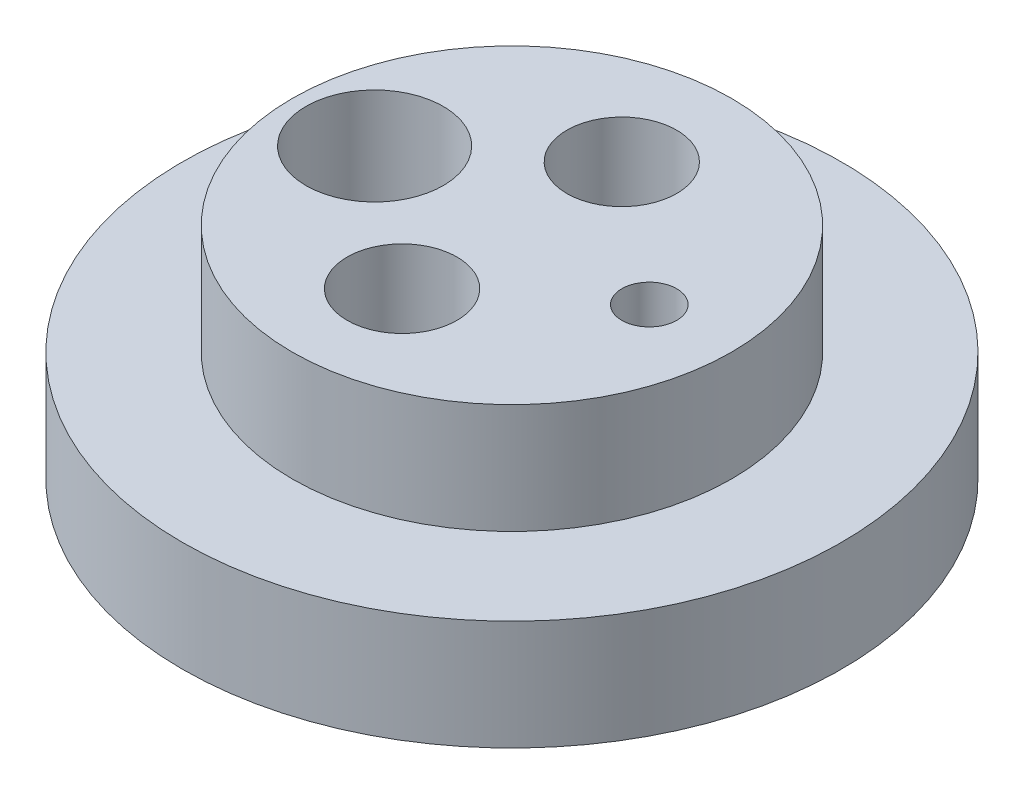
ISO-10303-21;
HEADER;
FILE_DESCRIPTION(('STEP AP214'),'2;1');
FILE_NAME('part.step','',(''),(''),'','','');
FILE_SCHEMA(('AUTOMOTIVE_DESIGN { 1 0 10303 214 1 1 1 1 }'));
ENDSEC;
DATA;
#1=APPLICATION_CONTEXT('core data for automotive mechanical design processes');
#2=APPLICATION_PROTOCOL_DEFINITION('international standard','automotive_design',2000,#1);
#3=PRODUCT_CONTEXT('',#1,'mechanical');
#4=PRODUCT('Part','Part','',(#3));
#5=PRODUCT_RELATED_PRODUCT_CATEGORY('part','',(#4));
#6=PRODUCT_DEFINITION_FORMATION('','',#4);
#7=PRODUCT_DEFINITION_CONTEXT('part definition',#1,'design');
#8=PRODUCT_DEFINITION('design','',#6,#7);
#9=PRODUCT_DEFINITION_SHAPE('','',#8);
#10=(LENGTH_UNIT() NAMED_UNIT(*) SI_UNIT(.MILLI.,.METRE.));
#11=(NAMED_UNIT(*) PLANE_ANGLE_UNIT() SI_UNIT($,.RADIAN.));
#12=(NAMED_UNIT(*) SI_UNIT($,.STERADIAN.) SOLID_ANGLE_UNIT());
#13=UNCERTAINTY_MEASURE_WITH_UNIT(LENGTH_MEASURE(1.E-05),#10,'distance_accuracy_value','');
#14=(GEOMETRIC_REPRESENTATION_CONTEXT(3) GLOBAL_UNCERTAINTY_ASSIGNED_CONTEXT((#13)) GLOBAL_UNIT_ASSIGNED_CONTEXT((#10,
#11,#12)) REPRESENTATION_CONTEXT('',''));
#15=CARTESIAN_POINT('',(0.,0.,0.));
#16=DIRECTION('',(0.,0.,1.));
#17=DIRECTION('',(1.,0.,0.));
#18=AXIS2_PLACEMENT_3D('',#15,#16,#17);
#19=CARTESIAN_POINT('',(0.,8.,0.));
#20=DIRECTION('',(0.,-1.,0.));
#21=DIRECTION('',(0.,0.,-1.));
#22=AXIS2_PLACEMENT_3D('',#19,#20,#21);
#23=CYLINDRICAL_SURFACE('',#22,24.);
#24=CARTESIAN_POINT('',(0.,8.,0.));
#25=DIRECTION('',(0.,1.,0.));
#26=DIRECTION('',(0.,0.,1.));
#27=AXIS2_PLACEMENT_3D('',#24,#25,#26);
#28=CIRCLE('',#27,24.);
#29=CARTESIAN_POINT('',(0.,8.,24.));
#30=VERTEX_POINT('',#29);
#31=EDGE_CURVE('E51',#30,#30,#28,.T.);
#32=ORIENTED_EDGE('',*,*,#31,.F.);
#33=EDGE_LOOP('',(#32));
#34=FACE_BOUND('',#33,.T.);
#35=CARTESIAN_POINT('',(0.,0.,0.));
#36=DIRECTION('',(0.,1.,0.));
#37=DIRECTION('',(0.,0.,1.));
#38=AXIS2_PLACEMENT_3D('',#35,#36,#37);
#39=CIRCLE('',#38,24.);
#40=CARTESIAN_POINT('',(0.,0.,24.));
#41=VERTEX_POINT('',#40);
#42=EDGE_CURVE('E46',#41,#41,#39,.T.);
#43=ORIENTED_EDGE('',*,*,#42,.T.);
#44=EDGE_LOOP('',(#43));
#45=FACE_BOUND('',#44,.T.);
#46=ADVANCED_FACE('F43',(#34,#45),#23,.T.);
#47=CARTESIAN_POINT('',(0.,8.,0.));
#48=DIRECTION('',(0.,1.,0.));
#49=DIRECTION('',(0.,0.,1.));
#50=AXIS2_PLACEMENT_3D('',#47,#48,#49);
#51=PLANE('',#50);
#52=CARTESIAN_POINT('',(0.,8.,0.));
#53=DIRECTION('',(0.,1.,0.));
#54=DIRECTION('',(0.,0.,1.));
#55=AXIS2_PLACEMENT_3D('',#52,#53,#54);
#56=CIRCLE('',#55,16.);
#57=CARTESIAN_POINT('',(0.,8.,16.));
#58=VERTEX_POINT('',#57);
#59=EDGE_CURVE('E10',#58,#58,#56,.T.);
#60=ORIENTED_EDGE('',*,*,#59,.F.);
#61=EDGE_LOOP('',(#60));
#62=FACE_BOUND('',#61,.T.);
#63=ORIENTED_EDGE('',*,*,#31,.T.);
#64=EDGE_LOOP('',(#63));
#65=FACE_BOUND('',#64,.T.);
#66=ADVANCED_FACE('F125',(#62,#65),#51,.T.);
#67=CARTESIAN_POINT('',(0.,0.,0.));
#68=DIRECTION('',(0.,1.,0.));
#69=DIRECTION('',(0.,0.,1.));
#70=AXIS2_PLACEMENT_3D('',#67,#68,#69);
#71=PLANE('',#70);
#72=CARTESIAN_POINT('',(-10.,0.,0.));
#73=DIRECTION('',(0.,1.,0.));
#74=DIRECTION('',(0.,0.,1.));
#75=AXIS2_PLACEMENT_3D('',#72,#73,#74);
#76=CIRCLE('',#75,5.);
#77=CARTESIAN_POINT('',(-10.,0.,5.));
#78=VERTEX_POINT('',#77);
#79=EDGE_CURVE('E62',#78,#78,#76,.T.);
#80=ORIENTED_EDGE('',*,*,#79,.T.);
#81=EDGE_LOOP('',(#80));
#82=FACE_BOUND('',#81,.T.);
#83=CARTESIAN_POINT('',(0.,0.,-8.));
#84=DIRECTION('',(0.,1.,0.));
#85=DIRECTION('',(0.,0.,1.));
#86=AXIS2_PLACEMENT_3D('',#83,#84,#85);
#87=CIRCLE('',#86,4.);
#88=CARTESIAN_POINT('',(0.,0.,-4.));
#89=VERTEX_POINT('',#88);
#90=EDGE_CURVE('E79',#89,#89,#87,.T.);
#91=ORIENTED_EDGE('',*,*,#90,.T.);
#92=EDGE_LOOP('',(#91));
#93=FACE_BOUND('',#92,.T.);
#94=CARTESIAN_POINT('',(0.,0.,8.));
#95=DIRECTION('',(0.,1.,0.));
#96=DIRECTION('',(0.,0.,1.));
#97=AXIS2_PLACEMENT_3D('',#94,#95,#96);
#98=CIRCLE('',#97,4.);
#99=CARTESIAN_POINT('',(0.,0.,12.));
#100=VERTEX_POINT('',#99);
#101=EDGE_CURVE('E71',#100,#100,#98,.T.);
#102=ORIENTED_EDGE('',*,*,#101,.T.);
#103=EDGE_LOOP('',(#102));
#104=FACE_BOUND('',#103,.T.);
#105=CARTESIAN_POINT('',(10.,0.,0.));
#106=DIRECTION('',(0.,1.,0.));
#107=DIRECTION('',(0.,0.,1.));
#108=AXIS2_PLACEMENT_3D('',#105,#106,#107);
#109=CIRCLE('',#108,2.);
#110=CARTESIAN_POINT('',(10.,0.,2.));
#111=VERTEX_POINT('',#110);
#112=EDGE_CURVE('E63',#111,#111,#109,.T.);
#113=ORIENTED_EDGE('',*,*,#112,.T.);
#114=EDGE_LOOP('',(#113));
#115=FACE_BOUND('',#114,.T.);
#116=ORIENTED_EDGE('',*,*,#42,.F.);
#117=EDGE_LOOP('',(#116));
#118=FACE_BOUND('',#117,.T.);
#119=ADVANCED_FACE('F95',(#82,#93,#104,#115,#118),#71,.F.);
#120=CARTESIAN_POINT('',(0.,16.,0.));
#121=DIRECTION('',(0.,-1.,0.));
#122=DIRECTION('',(0.,0.,-1.));
#123=AXIS2_PLACEMENT_3D('',#120,#121,#122);
#124=CYLINDRICAL_SURFACE('',#123,16.);
#125=CARTESIAN_POINT('',(0.,16.,0.));
#126=DIRECTION('',(0.,1.,0.));
#127=DIRECTION('',(0.,0.,1.));
#128=AXIS2_PLACEMENT_3D('',#125,#126,#127);
#129=CIRCLE('',#128,16.);
#130=CARTESIAN_POINT('',(0.,16.,16.));
#131=VERTEX_POINT('',#130);
#132=EDGE_CURVE('E58',#131,#131,#129,.T.);
#133=ORIENTED_EDGE('',*,*,#132,.F.);
#134=EDGE_LOOP('',(#133));
#135=FACE_BOUND('',#134,.T.);
#136=ORIENTED_EDGE('',*,*,#59,.T.);
#137=EDGE_LOOP('',(#136));
#138=FACE_BOUND('',#137,.T.);
#139=ADVANCED_FACE('F109',(#135,#138),#124,.T.);
#140=CARTESIAN_POINT('',(0.,16.,0.));
#141=DIRECTION('',(0.,1.,0.));
#142=DIRECTION('',(0.,0.,1.));
#143=AXIS2_PLACEMENT_3D('',#140,#141,#142);
#144=PLANE('',#143);
#145=CARTESIAN_POINT('',(-10.,16.,0.));
#146=DIRECTION('',(0.,1.,0.));
#147=DIRECTION('',(0.,0.,1.));
#148=AXIS2_PLACEMENT_3D('',#145,#146,#147);
#149=CIRCLE('',#148,5.);
#150=CARTESIAN_POINT('',(-10.,16.,5.));
#151=VERTEX_POINT('',#150);
#152=EDGE_CURVE('E87',#151,#151,#149,.T.);
#153=ORIENTED_EDGE('',*,*,#152,.F.);
#154=EDGE_LOOP('',(#153));
#155=FACE_BOUND('',#154,.T.);
#156=CARTESIAN_POINT('',(0.,16.,-8.));
#157=DIRECTION('',(0.,1.,0.));
#158=DIRECTION('',(0.,0.,1.));
#159=AXIS2_PLACEMENT_3D('',#156,#157,#158);
#160=CIRCLE('',#159,4.);
#161=CARTESIAN_POINT('',(0.,16.,-4.));
#162=VERTEX_POINT('',#161);
#163=EDGE_CURVE('E83',#162,#162,#160,.T.);
#164=ORIENTED_EDGE('',*,*,#163,.F.);
#165=EDGE_LOOP('',(#164));
#166=FACE_BOUND('',#165,.T.);
#167=CARTESIAN_POINT('',(0.,16.,8.));
#168=DIRECTION('',(0.,1.,0.));
#169=DIRECTION('',(0.,0.,1.));
#170=AXIS2_PLACEMENT_3D('',#167,#168,#169);
#171=CIRCLE('',#170,4.);
#172=CARTESIAN_POINT('',(0.,16.,12.));
#173=VERTEX_POINT('',#172);
#174=EDGE_CURVE('E75',#173,#173,#171,.T.);
#175=ORIENTED_EDGE('',*,*,#174,.F.);
#176=EDGE_LOOP('',(#175));
#177=FACE_BOUND('',#176,.T.);
#178=CARTESIAN_POINT('',(10.,16.,0.));
#179=DIRECTION('',(0.,1.,0.));
#180=DIRECTION('',(0.,0.,1.));
#181=AXIS2_PLACEMENT_3D('',#178,#179,#180);
#182=CIRCLE('',#181,2.);
#183=CARTESIAN_POINT('',(10.,16.,2.));
#184=VERTEX_POINT('',#183);
#185=EDGE_CURVE('E67',#184,#184,#182,.T.);
#186=ORIENTED_EDGE('',*,*,#185,.F.);
#187=EDGE_LOOP('',(#186));
#188=FACE_BOUND('',#187,.T.);
#189=ORIENTED_EDGE('',*,*,#132,.T.);
#190=EDGE_LOOP('',(#189));
#191=FACE_BOUND('',#190,.T.);
#192=ADVANCED_FACE('F105',(#155,#166,#177,#188,#191),#144,.T.);
#193=CARTESIAN_POINT('',(10.,0.,0.));
#194=DIRECTION('',(0.,1.,0.));
#195=DIRECTION('',(0.,0.,1.));
#196=AXIS2_PLACEMENT_3D('',#193,#194,#195);
#197=CYLINDRICAL_SURFACE('',#196,2.);
#198=ORIENTED_EDGE('',*,*,#112,.F.);
#199=EDGE_LOOP('',(#198));
#200=FACE_BOUND('',#199,.T.);
#201=ORIENTED_EDGE('',*,*,#185,.T.);
#202=EDGE_LOOP('',(#201));
#203=FACE_BOUND('',#202,.T.);
#204=ADVANCED_FACE('F108',(#200,#203),#197,.F.);
#205=CARTESIAN_POINT('',(0.,0.,8.));
#206=DIRECTION('',(0.,1.,0.));
#207=DIRECTION('',(0.,0.,1.));
#208=AXIS2_PLACEMENT_3D('',#205,#206,#207);
#209=CYLINDRICAL_SURFACE('',#208,4.);
#210=ORIENTED_EDGE('',*,*,#101,.F.);
#211=EDGE_LOOP('',(#210));
#212=FACE_BOUND('',#211,.T.);
#213=ORIENTED_EDGE('',*,*,#174,.T.);
#214=EDGE_LOOP('',(#213));
#215=FACE_BOUND('',#214,.T.);
#216=ADVANCED_FACE('F170',(#212,#215),#209,.F.);
#217=CARTESIAN_POINT('',(0.,0.,-8.));
#218=DIRECTION('',(0.,1.,0.));
#219=DIRECTION('',(0.,0.,1.));
#220=AXIS2_PLACEMENT_3D('',#217,#218,#219);
#221=CYLINDRICAL_SURFACE('',#220,4.);
#222=ORIENTED_EDGE('',*,*,#90,.F.);
#223=EDGE_LOOP('',(#222));
#224=FACE_BOUND('',#223,.T.);
#225=ORIENTED_EDGE('',*,*,#163,.T.);
#226=EDGE_LOOP('',(#225));
#227=FACE_BOUND('',#226,.T.);
#228=ADVANCED_FACE('F101',(#224,#227),#221,.F.);
#229=CARTESIAN_POINT('',(-10.,0.,0.));
#230=DIRECTION('',(0.,1.,0.));
#231=DIRECTION('',(0.,0.,1.));
#232=AXIS2_PLACEMENT_3D('',#229,#230,#231);
#233=CYLINDRICAL_SURFACE('',#232,5.);
#234=ORIENTED_EDGE('',*,*,#79,.F.);
#235=EDGE_LOOP('',(#234));
#236=FACE_BOUND('',#235,.T.);
#237=ORIENTED_EDGE('',*,*,#152,.T.);
#238=EDGE_LOOP('',(#237));
#239=FACE_BOUND('',#238,.T.);
#240=ADVANCED_FACE('F98',(#236,#239),#233,.F.);
#241=CLOSED_SHELL('',(#46,#66,#119,#139,#192,#204,#216,#228,#240));
#242=MANIFOLD_SOLID_BREP('B2',#241);
#243=ADVANCED_BREP_SHAPE_REPRESENTATION('',(#18,#242),#14);
#244=SHAPE_DEFINITION_REPRESENTATION(#9,#243);
ENDSEC;
END-ISO-10303-21;
